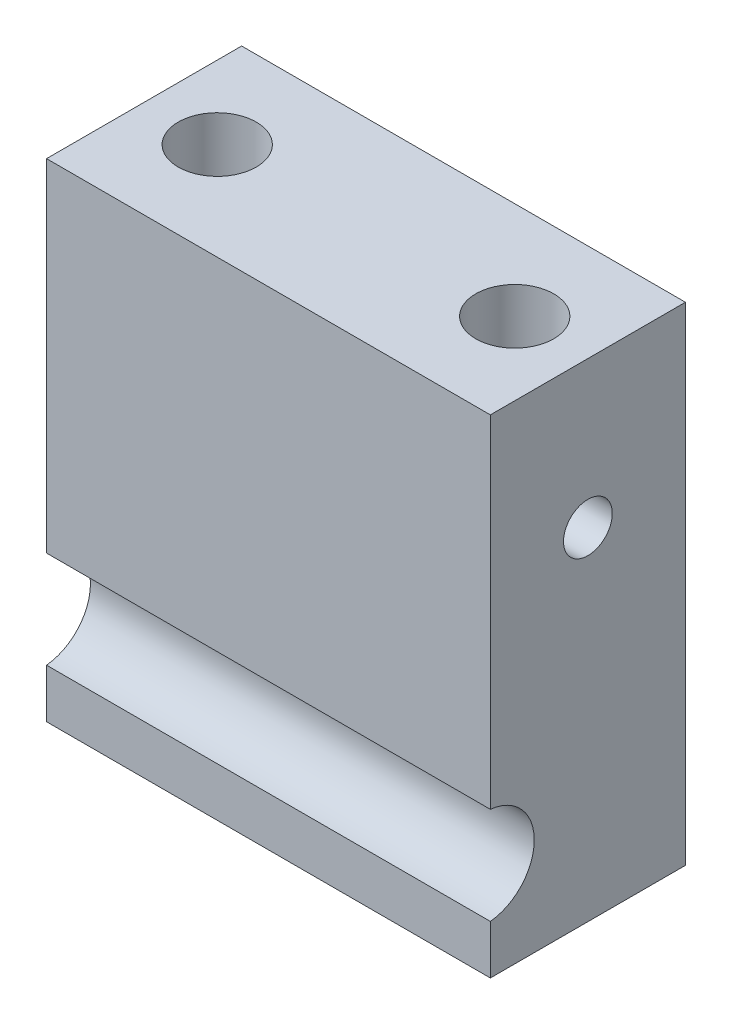
ISO-10303-21;
HEADER;
FILE_DESCRIPTION(('STEP AP214'),'2;1');
FILE_NAME('part.step','',(''),(''),'','','');
FILE_SCHEMA(('AUTOMOTIVE_DESIGN { 1 0 10303 214 1 1 1 1 }'));
ENDSEC;
DATA;
#1=APPLICATION_CONTEXT('core data for automotive mechanical design processes');
#2=APPLICATION_PROTOCOL_DEFINITION('international standard','automotive_design',2000,#1);
#3=PRODUCT_CONTEXT('',#1,'mechanical');
#4=PRODUCT('Part','Part','',(#3));
#5=PRODUCT_RELATED_PRODUCT_CATEGORY('part','',(#4));
#6=PRODUCT_DEFINITION_FORMATION('','',#4);
#7=PRODUCT_DEFINITION_CONTEXT('part definition',#1,'design');
#8=PRODUCT_DEFINITION('design','',#6,#7);
#9=PRODUCT_DEFINITION_SHAPE('','',#8);
#10=(LENGTH_UNIT() NAMED_UNIT(*) SI_UNIT(.MILLI.,.METRE.));
#11=(NAMED_UNIT(*) PLANE_ANGLE_UNIT() SI_UNIT($,.RADIAN.));
#12=(NAMED_UNIT(*) SI_UNIT($,.STERADIAN.) SOLID_ANGLE_UNIT());
#13=UNCERTAINTY_MEASURE_WITH_UNIT(LENGTH_MEASURE(1.E-05),#10,'distance_accuracy_value','');
#14=(GEOMETRIC_REPRESENTATION_CONTEXT(3) GLOBAL_UNCERTAINTY_ASSIGNED_CONTEXT((#13)) GLOBAL_UNIT_ASSIGNED_CONTEXT((#10,
#11,#12)) REPRESENTATION_CONTEXT('',''));
#15=CARTESIAN_POINT('',(0.,0.,0.));
#16=DIRECTION('',(0.,0.,1.));
#17=DIRECTION('',(1.,0.,0.));
#18=AXIS2_PLACEMENT_3D('',#15,#16,#17);
#19=CARTESIAN_POINT('',(-4.55,10.,2.));
#20=DIRECTION('',(0.,0.,-1.));
#21=DIRECTION('',(-1.,0.,0.));
#22=AXIS2_PLACEMENT_3D('',#19,#20,#21);
#23=PLANE('',#22);
#24=DIRECTION('',(0.,-1.,0.));
#25=VECTOR('',#24,1.);
#26=CARTESIAN_POINT('',(4.55,10.,2.));
#27=LINE('',#26,#25);
#28=CARTESIAN_POINT('',(4.55,1.00501256289338,2.));
#29=VERTEX_POINT('',#28);
#30=CARTESIAN_POINT('',(4.55,0.,2.));
#31=VERTEX_POINT('',#30);
#32=EDGE_CURVE('E80',#29,#31,#27,.T.);
#33=ORIENTED_EDGE('',*,*,#32,.F.);
#34=DIRECTION('',(-1.,0.,0.));
#35=VECTOR('',#34,1.);
#36=CARTESIAN_POINT('',(4.55,1.00501256289338,2.));
#37=LINE('',#36,#35);
#38=CARTESIAN_POINT('',(-4.55,1.00501256289338,2.));
#39=VERTEX_POINT('',#38);
#40=EDGE_CURVE('E11',#29,#39,#37,.T.);
#41=ORIENTED_EDGE('',*,*,#40,.T.);
#42=DIRECTION('',(0.,-1.,0.));
#43=VECTOR('',#42,1.);
#44=CARTESIAN_POINT('',(-4.55,10.,2.));
#45=LINE('',#44,#43);
#46=CARTESIAN_POINT('',(-4.55,0.,2.));
#47=VERTEX_POINT('',#46);
#48=EDGE_CURVE('E109',#39,#47,#45,.T.);
#49=ORIENTED_EDGE('',*,*,#48,.T.);
#50=DIRECTION('',(1.,0.,0.));
#51=VECTOR('',#50,1.);
#52=CARTESIAN_POINT('',(-4.55,0.,2.));
#53=LINE('',#52,#51);
#54=EDGE_CURVE('E139',#47,#31,#53,.T.);
#55=ORIENTED_EDGE('',*,*,#54,.T.);
#56=EDGE_LOOP('',(#33,#41,#49,#55));
#57=FACE_BOUND('',#56,.T.);
#58=ADVANCED_FACE('F35',(#57),#23,.F.);
#59=CARTESIAN_POINT('',(4.55,10.,-2.));
#60=DIRECTION('',(-1.,0.,0.));
#61=DIRECTION('',(0.,0.,1.));
#62=AXIS2_PLACEMENT_3D('',#59,#60,#61);
#63=PLANE('',#62);
#64=CARTESIAN_POINT('',(4.55,7.,0.));
#65=DIRECTION('',(-1.,0.,0.));
#66=DIRECTION('',(0.,0.,1.));
#67=AXIS2_PLACEMENT_3D('',#64,#65,#66);
#68=CIRCLE('',#67,0.500000000000001);
#69=CARTESIAN_POINT('',(4.55,7.,0.499999999999999));
#70=VERTEX_POINT('',#69);
#71=EDGE_CURVE('E129',#70,#70,#68,.T.);
#72=ORIENTED_EDGE('',*,*,#71,.T.);
#73=EDGE_LOOP('',(#72));
#74=FACE_BOUND('',#73,.T.);
#75=CARTESIAN_POINT('',(4.55,10.,2.));
#76=VERTEX_POINT('',#75);
#77=CARTESIAN_POINT('',(4.55,2.99498743710662,2.));
#78=VERTEX_POINT('',#77);
#79=EDGE_CURVE('E117',#76,#78,#27,.T.);
#80=ORIENTED_EDGE('',*,*,#79,.T.);
#81=CARTESIAN_POINT('',(4.55,2.,2.1));
#82=DIRECTION('',(-1.,0.,0.));
#83=DIRECTION('',(0.,0.,1.));
#84=AXIS2_PLACEMENT_3D('',#81,#82,#83);
#85=CIRCLE('',#84,1.);
#86=EDGE_CURVE('E50',#78,#29,#85,.T.);
#87=ORIENTED_EDGE('',*,*,#86,.T.);
#88=ORIENTED_EDGE('',*,*,#32,.T.);
#89=DIRECTION('',(0.,0.,-1.));
#90=VECTOR('',#89,1.);
#91=CARTESIAN_POINT('',(4.55,0.,-2.));
#92=LINE('',#91,#90);
#93=CARTESIAN_POINT('',(4.55,0.,-2.));
#94=VERTEX_POINT('',#93);
#95=EDGE_CURVE('E126',#31,#94,#92,.T.);
#96=ORIENTED_EDGE('',*,*,#95,.T.);
#97=DIRECTION('',(0.,-1.,0.));
#98=VECTOR('',#97,1.);
#99=CARTESIAN_POINT('',(4.55,10.,-2.));
#100=LINE('',#99,#98);
#101=CARTESIAN_POINT('',(4.55,10.,-2.));
#102=VERTEX_POINT('',#101);
#103=EDGE_CURVE('E101',#102,#94,#100,.T.);
#104=ORIENTED_EDGE('',*,*,#103,.F.);
#105=DIRECTION('',(0.,0.,-1.));
#106=VECTOR('',#105,1.);
#107=CARTESIAN_POINT('',(4.55,10.,-2.));
#108=LINE('',#107,#106);
#109=EDGE_CURVE('E140',#76,#102,#108,.T.);
#110=ORIENTED_EDGE('',*,*,#109,.F.);
#111=EDGE_LOOP('',(#80,#87,#88,#96,#104,#110));
#112=FACE_BOUND('',#111,.T.);
#113=ADVANCED_FACE('F37',(#74,#112),#63,.F.);
#114=CARTESIAN_POINT('',(-4.55,10.,-2.));
#115=DIRECTION('',(0.,0.,1.));
#116=DIRECTION('',(1.,0.,0.));
#117=AXIS2_PLACEMENT_3D('',#114,#115,#116);
#118=PLANE('',#117);
#119=DIRECTION('',(-1.,0.,0.));
#120=VECTOR('',#119,1.);
#121=CARTESIAN_POINT('',(-4.55,0.,-2.));
#122=LINE('',#121,#120);
#123=CARTESIAN_POINT('',(-4.55,0.,-2.));
#124=VERTEX_POINT('',#123);
#125=EDGE_CURVE('E123',#94,#124,#122,.T.);
#126=ORIENTED_EDGE('',*,*,#125,.T.);
#127=DIRECTION('',(0.,-1.,0.));
#128=VECTOR('',#127,1.);
#129=CARTESIAN_POINT('',(-4.55,10.,-2.));
#130=LINE('',#129,#128);
#131=CARTESIAN_POINT('',(-4.55,10.,-2.));
#132=VERTEX_POINT('',#131);
#133=EDGE_CURVE('E113',#132,#124,#130,.T.);
#134=ORIENTED_EDGE('',*,*,#133,.F.);
#135=DIRECTION('',(-1.,0.,0.));
#136=VECTOR('',#135,1.);
#137=CARTESIAN_POINT('',(-4.55,10.,-2.));
#138=LINE('',#137,#136);
#139=EDGE_CURVE('E88',#102,#132,#138,.T.);
#140=ORIENTED_EDGE('',*,*,#139,.F.);
#141=ORIENTED_EDGE('',*,*,#103,.T.);
#142=EDGE_LOOP('',(#126,#134,#140,#141));
#143=FACE_BOUND('',#142,.T.);
#144=ADVANCED_FACE('F122',(#143),#118,.F.);
#145=CARTESIAN_POINT('',(-4.55,10.,-2.));
#146=DIRECTION('',(1.,0.,0.));
#147=DIRECTION('',(0.,0.,-1.));
#148=AXIS2_PLACEMENT_3D('',#145,#146,#147);
#149=PLANE('',#148);
#150=CARTESIAN_POINT('',(-4.55,7.,0.));
#151=DIRECTION('',(-1.,0.,0.));
#152=DIRECTION('',(0.,0.,1.));
#153=AXIS2_PLACEMENT_3D('',#150,#151,#152);
#154=CIRCLE('',#153,0.500000000000001);
#155=CARTESIAN_POINT('',(-4.55,7.,0.500000000000001));
#156=VERTEX_POINT('',#155);
#157=EDGE_CURVE('E134',#156,#156,#154,.T.);
#158=ORIENTED_EDGE('',*,*,#157,.F.);
#159=EDGE_LOOP('',(#158));
#160=FACE_BOUND('',#159,.T.);
#161=ORIENTED_EDGE('',*,*,#48,.F.);
#162=CARTESIAN_POINT('',(-4.55,2.,2.1));
#163=DIRECTION('',(-1.,0.,0.));
#164=DIRECTION('',(0.,0.,1.));
#165=AXIS2_PLACEMENT_3D('',#162,#163,#164);
#166=CIRCLE('',#165,1.);
#167=CARTESIAN_POINT('',(-4.55,2.99498743710662,2.));
#168=VERTEX_POINT('',#167);
#169=EDGE_CURVE('E97',#168,#39,#166,.T.);
#170=ORIENTED_EDGE('',*,*,#169,.F.);
#171=CARTESIAN_POINT('',(-4.55,10.,2.));
#172=VERTEX_POINT('',#171);
#173=EDGE_CURVE('E107',#172,#168,#45,.T.);
#174=ORIENTED_EDGE('',*,*,#173,.F.);
#175=DIRECTION('',(0.,0.,1.));
#176=VECTOR('',#175,1.);
#177=CARTESIAN_POINT('',(-4.55,10.,-2.));
#178=LINE('',#177,#176);
#179=EDGE_CURVE('E143',#132,#172,#178,.T.);
#180=ORIENTED_EDGE('',*,*,#179,.F.);
#181=ORIENTED_EDGE('',*,*,#133,.T.);
#182=DIRECTION('',(0.,0.,1.));
#183=VECTOR('',#182,1.);
#184=CARTESIAN_POINT('',(-4.55,0.,-2.));
#185=LINE('',#184,#183);
#186=EDGE_CURVE('E131',#124,#47,#185,.T.);
#187=ORIENTED_EDGE('',*,*,#186,.T.);
#188=EDGE_LOOP('',(#161,#170,#174,#180,#181,#187));
#189=FACE_BOUND('',#188,.T.);
#190=ADVANCED_FACE('F105',(#160,#189),#149,.F.);
#191=ORIENTED_EDGE('',*,*,#173,.T.);
#192=DIRECTION('',(-1.,0.,0.));
#193=VECTOR('',#192,1.);
#194=CARTESIAN_POINT('',(4.55,2.99498743710662,2.));
#195=LINE('',#194,#193);
#196=EDGE_CURVE('E43',#168,#78,#195,.F.);
#197=ORIENTED_EDGE('',*,*,#196,.T.);
#198=ORIENTED_EDGE('',*,*,#79,.F.);
#199=DIRECTION('',(1.,0.,0.));
#200=VECTOR('',#199,1.);
#201=CARTESIAN_POINT('',(-4.55,10.,2.));
#202=LINE('',#201,#200);
#203=EDGE_CURVE('E59',#172,#76,#202,.T.);
#204=ORIENTED_EDGE('',*,*,#203,.F.);
#205=EDGE_LOOP('',(#191,#197,#198,#204));
#206=FACE_BOUND('',#205,.T.);
#207=ADVANCED_FACE('F112',(#206),#23,.F.);
#208=CARTESIAN_POINT('',(0.,10.,0.));
#209=DIRECTION('',(0.,1.,0.));
#210=DIRECTION('',(0.,0.,1.));
#211=AXIS2_PLACEMENT_3D('',#208,#209,#210);
#212=PLANE('',#211);
#213=CARTESIAN_POINT('',(3.05,10.,0.));
#214=DIRECTION('',(0.,1.,0.));
#215=DIRECTION('',(0.,0.,1.));
#216=AXIS2_PLACEMENT_3D('',#213,#214,#215);
#217=CIRCLE('',#216,0.8);
#218=CARTESIAN_POINT('',(3.05,10.,0.8));
#219=VERTEX_POINT('',#218);
#220=EDGE_CURVE('E185',#219,#219,#217,.T.);
#221=ORIENTED_EDGE('',*,*,#220,.F.);
#222=EDGE_LOOP('',(#221));
#223=FACE_BOUND('',#222,.T.);
#224=CARTESIAN_POINT('',(-3.05,10.,0.));
#225=DIRECTION('',(0.,1.,0.));
#226=DIRECTION('',(0.,0.,1.));
#227=AXIS2_PLACEMENT_3D('',#224,#225,#226);
#228=CIRCLE('',#227,0.8);
#229=CARTESIAN_POINT('',(-3.05,10.,0.8));
#230=VERTEX_POINT('',#229);
#231=EDGE_CURVE('E179',#230,#230,#228,.T.);
#232=ORIENTED_EDGE('',*,*,#231,.F.);
#233=EDGE_LOOP('',(#232));
#234=FACE_BOUND('',#233,.T.);
#235=ORIENTED_EDGE('',*,*,#109,.T.);
#236=ORIENTED_EDGE('',*,*,#139,.T.);
#237=ORIENTED_EDGE('',*,*,#179,.T.);
#238=ORIENTED_EDGE('',*,*,#203,.T.);
#239=EDGE_LOOP('',(#235,#236,#237,#238));
#240=FACE_BOUND('',#239,.T.);
#241=ADVANCED_FACE('F149',(#223,#234,#240),#212,.T.);
#242=CARTESIAN_POINT('',(0.,0.,0.));
#243=DIRECTION('',(0.,1.,0.));
#244=DIRECTION('',(0.,0.,1.));
#245=AXIS2_PLACEMENT_3D('',#242,#243,#244);
#246=PLANE('',#245);
#247=ORIENTED_EDGE('',*,*,#95,.F.);
#248=ORIENTED_EDGE('',*,*,#54,.F.);
#249=ORIENTED_EDGE('',*,*,#186,.F.);
#250=ORIENTED_EDGE('',*,*,#125,.F.);
#251=EDGE_LOOP('',(#247,#248,#249,#250));
#252=FACE_BOUND('',#251,.T.);
#253=ADVANCED_FACE('F147',(#252),#246,.F.);
#254=CARTESIAN_POINT('',(4.55,2.,2.1));
#255=DIRECTION('',(-1.,0.,0.));
#256=DIRECTION('',(0.,0.,1.));
#257=AXIS2_PLACEMENT_3D('',#254,#255,#256);
#258=CYLINDRICAL_SURFACE('',#257,1.);
#259=ORIENTED_EDGE('',*,*,#86,.F.);
#260=ORIENTED_EDGE('',*,*,#196,.F.);
#261=ORIENTED_EDGE('',*,*,#169,.T.);
#262=ORIENTED_EDGE('',*,*,#40,.F.);
#263=EDGE_LOOP('',(#259,#260,#261,#262));
#264=FACE_BOUND('',#263,.T.);
#265=ADVANCED_FACE('F96',(#264),#258,.F.);
#266=CARTESIAN_POINT('',(4.55,7.,0.));
#267=DIRECTION('',(-1.,0.,0.));
#268=DIRECTION('',(0.,0.,1.));
#269=AXIS2_PLACEMENT_3D('',#266,#267,#268);
#270=CYLINDRICAL_SURFACE('',#269,0.500000000000001);
#271=ORIENTED_EDGE('',*,*,#71,.F.);
#272=EDGE_LOOP('',(#271));
#273=FACE_BOUND('',#272,.T.);
#274=ORIENTED_EDGE('',*,*,#157,.T.);
#275=EDGE_LOOP('',(#274));
#276=FACE_BOUND('',#275,.T.);
#277=ADVANCED_FACE('F155',(#273,#276),#270,.F.);
#278=CARTESIAN_POINT('',(-3.05,8.,0.));
#279=DIRECTION('',(0.,1.,0.));
#280=DIRECTION('',(0.,0.,1.));
#281=AXIS2_PLACEMENT_3D('',#278,#279,#280);
#282=CYLINDRICAL_SURFACE('',#281,0.8);
#283=CARTESIAN_POINT('',(-3.05,8.,0.));
#284=DIRECTION('',(0.,1.,0.));
#285=DIRECTION('',(0.,0.,1.));
#286=AXIS2_PLACEMENT_3D('',#283,#284,#285);
#287=CIRCLE('',#286,0.8);
#288=CARTESIAN_POINT('',(-3.05,8.,0.8));
#289=VERTEX_POINT('',#288);
#290=EDGE_CURVE('E182',#289,#289,#287,.T.);
#291=ORIENTED_EDGE('',*,*,#290,.F.);
#292=EDGE_LOOP('',(#291));
#293=FACE_BOUND('',#292,.T.);
#294=ORIENTED_EDGE('',*,*,#231,.T.);
#295=EDGE_LOOP('',(#294));
#296=FACE_BOUND('',#295,.T.);
#297=ADVANCED_FACE('F202',(#293,#296),#282,.F.);
#298=CARTESIAN_POINT('',(-3.05,8.,0.));
#299=DIRECTION('',(0.,1.,0.));
#300=DIRECTION('',(0.,0.,1.));
#301=AXIS2_PLACEMENT_3D('',#298,#299,#300);
#302=PLANE('',#301);
#303=ORIENTED_EDGE('',*,*,#290,.T.);
#304=EDGE_LOOP('',(#303));
#305=FACE_BOUND('',#304,.T.);
#306=ADVANCED_FACE('F196',(#305),#302,.T.);
#307=CARTESIAN_POINT('',(3.05,8.,0.));
#308=DIRECTION('',(0.,1.,0.));
#309=DIRECTION('',(0.,0.,1.));
#310=AXIS2_PLACEMENT_3D('',#307,#308,#309);
#311=CYLINDRICAL_SURFACE('',#310,0.8);
#312=CARTESIAN_POINT('',(3.05,8.,0.));
#313=DIRECTION('',(0.,1.,0.));
#314=DIRECTION('',(0.,0.,1.));
#315=AXIS2_PLACEMENT_3D('',#312,#313,#314);
#316=CIRCLE('',#315,0.8);
#317=CARTESIAN_POINT('',(3.05,8.,0.8));
#318=VERTEX_POINT('',#317);
#319=EDGE_CURVE('E110',#318,#318,#316,.T.);
#320=ORIENTED_EDGE('',*,*,#319,.F.);
#321=EDGE_LOOP('',(#320));
#322=FACE_BOUND('',#321,.T.);
#323=ORIENTED_EDGE('',*,*,#220,.T.);
#324=EDGE_LOOP('',(#323));
#325=FACE_BOUND('',#324,.T.);
#326=ADVANCED_FACE('F193',(#322,#325),#311,.F.);
#327=CARTESIAN_POINT('',(3.05,8.,0.));
#328=DIRECTION('',(0.,1.,0.));
#329=DIRECTION('',(0.,0.,1.));
#330=AXIS2_PLACEMENT_3D('',#327,#328,#329);
#331=PLANE('',#330);
#332=ORIENTED_EDGE('',*,*,#319,.T.);
#333=EDGE_LOOP('',(#332));
#334=FACE_BOUND('',#333,.T.);
#335=ADVANCED_FACE('F191',(#334),#331,.T.);
#336=CLOSED_SHELL('',(#58,#113,#144,#190,#207,#241,#253,#265,#277,#297,#306,#326,#335));
#337=MANIFOLD_SOLID_BREP('B2',#336);
#338=ADVANCED_BREP_SHAPE_REPRESENTATION('',(#18,#337),#14);
#339=SHAPE_DEFINITION_REPRESENTATION(#9,#338);
ENDSEC;
END-ISO-10303-21;
